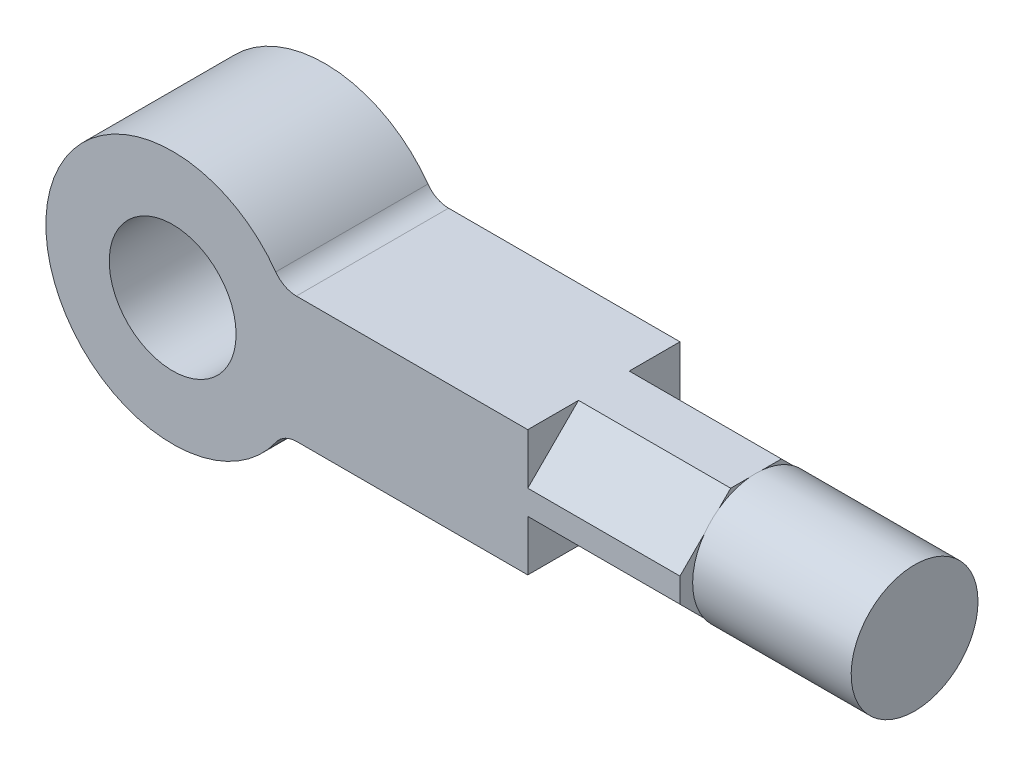
ISO-10303-21;
HEADER;
FILE_DESCRIPTION(('STEP AP214'),'2;1');
FILE_NAME('part.step','',(''),(''),'','','');
FILE_SCHEMA(('AUTOMOTIVE_DESIGN { 1 0 10303 214 1 1 1 1 }'));
ENDSEC;
DATA;
#1=APPLICATION_CONTEXT('core data for automotive mechanical design processes');
#2=APPLICATION_PROTOCOL_DEFINITION('international standard','automotive_design',2000,#1);
#3=PRODUCT_CONTEXT('',#1,'mechanical');
#4=PRODUCT('Part','Part','',(#3));
#5=PRODUCT_RELATED_PRODUCT_CATEGORY('part','',(#4));
#6=PRODUCT_DEFINITION_FORMATION('','',#4);
#7=PRODUCT_DEFINITION_CONTEXT('part definition',#1,'design');
#8=PRODUCT_DEFINITION('design','',#6,#7);
#9=PRODUCT_DEFINITION_SHAPE('','',#8);
#10=(LENGTH_UNIT() NAMED_UNIT(*) SI_UNIT(.MILLI.,.METRE.));
#11=(NAMED_UNIT(*) PLANE_ANGLE_UNIT() SI_UNIT($,.RADIAN.));
#12=(NAMED_UNIT(*) SI_UNIT($,.STERADIAN.) SOLID_ANGLE_UNIT());
#13=UNCERTAINTY_MEASURE_WITH_UNIT(LENGTH_MEASURE(1.E-05),#10,'distance_accuracy_value','');
#14=(GEOMETRIC_REPRESENTATION_CONTEXT(3) GLOBAL_UNCERTAINTY_ASSIGNED_CONTEXT((#13)) GLOBAL_UNIT_ASSIGNED_CONTEXT((#10,
#11,#12)) REPRESENTATION_CONTEXT('',''));
#15=CARTESIAN_POINT('',(0.,0.,0.));
#16=DIRECTION('',(0.,0.,1.));
#17=DIRECTION('',(1.,0.,0.));
#18=AXIS2_PLACEMENT_3D('',#15,#16,#17);
#19=CARTESIAN_POINT('',(80.,9.98244410223354,24.));
#20=DIRECTION('',(-1.,0.,0.));
#21=DIRECTION('',(0.,0.,1.));
#22=AXIS2_PLACEMENT_3D('',#19,#20,#21);
#23=PLANE('',#22);
#24=CARTESIAN_POINT('',(80.,0.0298576009008498,12.));
#25=DIRECTION('',(1.,0.,0.));
#26=DIRECTION('',(0.,0.,-1.));
#27=AXIS2_PLACEMENT_3D('',#24,#25,#26);
#28=CIRCLE('',#27,10.);
#29=CARTESIAN_POINT('',(80.,8.15998467006414,6.17754056783061));
#30=VERTEX_POINT('',#29);
#31=CARTESIAN_POINT('',(80.,9.98244410223354,11.0273634113964));
#32=VERTEX_POINT('',#31);
#33=EDGE_CURVE('E11',#30,#32,#28,.T.);
#34=ORIENTED_EDGE('',*,*,#33,.F.);
#35=DIRECTION('',(0.,-0.707106781186547,-0.707106781186548));
#36=VECTOR('',#35,1.);
#37=CARTESIAN_POINT('',(80.,1.98244410223354,0.));
#38=LINE('',#37,#36);
#39=CARTESIAN_POINT('',(80.,9.98244410223354,8.));
#40=VERTEX_POINT('',#39);
#41=EDGE_CURVE('E183',#40,#30,#38,.T.);
#42=ORIENTED_EDGE('',*,*,#41,.F.);
#43=DIRECTION('',(0.,0.,-1.));
#44=VECTOR('',#43,1.);
#45=CARTESIAN_POINT('',(80.,9.98244410223354,24.));
#46=LINE('',#45,#44);
#47=EDGE_CURVE('E330',#32,#40,#46,.T.);
#48=ORIENTED_EDGE('',*,*,#47,.F.);
#49=EDGE_LOOP('',(#34,#42,#48));
#50=FACE_BOUND('',#49,.T.);
#51=ADVANCED_FACE('F34',(#50),#23,.F.);
#52=CARTESIAN_POINT('',(80.,9.98244410223354,12.9726365886036));
#53=VERTEX_POINT('',#52);
#54=CARTESIAN_POINT('',(80.,8.15998467006414,17.8224594321694));
#55=VERTEX_POINT('',#54);
#56=EDGE_CURVE('E43',#53,#55,#28,.T.);
#57=ORIENTED_EDGE('',*,*,#56,.F.);
#58=CARTESIAN_POINT('',(80.,9.98244410223354,16.));
#59=VERTEX_POINT('',#58);
#60=EDGE_CURVE('E331',#59,#53,#46,.T.);
#61=ORIENTED_EDGE('',*,*,#60,.F.);
#62=DIRECTION('',(0.,0.707106781186548,-0.707106781186548));
#63=VECTOR('',#62,1.);
#64=CARTESIAN_POINT('',(80.,9.98244410223354,16.));
#65=LINE('',#64,#63);
#66=EDGE_CURVE('E233',#55,#59,#65,.T.);
#67=ORIENTED_EDGE('',*,*,#66,.F.);
#68=EDGE_LOOP('',(#57,#61,#67));
#69=FACE_BOUND('',#68,.T.);
#70=ADVANCED_FACE('F393',(#69),#23,.F.);
#71=CARTESIAN_POINT('',(80.,5.85231703307024,20.1301270691633));
#72=VERTEX_POINT('',#71);
#73=CARTESIAN_POINT('',(80.,-5.5948247573359,20.2681889412942));
#74=VERTEX_POINT('',#73);
#75=EDGE_CURVE('E224',#72,#74,#28,.T.);
#76=ORIENTED_EDGE('',*,*,#75,.F.);
#77=CARTESIAN_POINT('',(80.,1.98244410223354,24.));
#78=VERTEX_POINT('',#77);
#79=EDGE_CURVE('E232',#78,#72,#65,.T.);
#80=ORIENTED_EDGE('',*,*,#79,.F.);
#81=DIRECTION('',(0.,1.,0.));
#82=VECTOR('',#81,1.);
#83=CARTESIAN_POINT('',(80.,9.98244410223354,24.));
#84=LINE('',#83,#82);
#85=CARTESIAN_POINT('',(80.,-1.86301369863014,24.));
#86=VERTEX_POINT('',#85);
#87=EDGE_CURVE('E301',#86,#78,#84,.T.);
#88=ORIENTED_EDGE('',*,*,#87,.F.);
#89=DIRECTION('',(0.,0.707106781186548,0.707106781186548));
#90=VECTOR('',#89,1.);
#91=CARTESIAN_POINT('',(80.,-1.86301369863014,24.));
#92=LINE('',#91,#90);
#93=EDGE_CURVE('E52',#74,#86,#92,.T.);
#94=ORIENTED_EDGE('',*,*,#93,.F.);
#95=EDGE_LOOP('',(#76,#80,#88,#94));
#96=FACE_BOUND('',#95,.T.);
#97=ADVANCED_FACE('F405',(#96),#23,.F.);
#98=CARTESIAN_POINT('',(80.,-8.23833134039339,17.6246823582367));
#99=VERTEX_POINT('',#98);
#100=CARTESIAN_POINT('',(80.,-9.86301369863014,13.4598278840042));
#101=VERTEX_POINT('',#100);
#102=EDGE_CURVE('E60',#99,#101,#28,.T.);
#103=ORIENTED_EDGE('',*,*,#102,.F.);
#104=CARTESIAN_POINT('',(80.,-9.86301369863014,16.));
#105=VERTEX_POINT('',#104);
#106=EDGE_CURVE('E249',#105,#99,#92,.T.);
#107=ORIENTED_EDGE('',*,*,#106,.F.);
#108=DIRECTION('',(0.,0.,-1.));
#109=VECTOR('',#108,1.);
#110=CARTESIAN_POINT('',(80.,-9.86301369863014,24.));
#111=LINE('',#110,#109);
#112=EDGE_CURVE('E335',#105,#101,#111,.T.);
#113=ORIENTED_EDGE('',*,*,#112,.T.);
#114=EDGE_LOOP('',(#103,#107,#113));
#115=FACE_BOUND('',#114,.T.);
#116=ADVANCED_FACE('F407',(#115),#23,.F.);
#117=CARTESIAN_POINT('',(80.,-9.86301369863014,10.5401721159958));
#118=VERTEX_POINT('',#117);
#119=CARTESIAN_POINT('',(80.,-8.23833134039339,6.37531764176325));
#120=VERTEX_POINT('',#119);
#121=EDGE_CURVE('E205',#118,#120,#28,.T.);
#122=ORIENTED_EDGE('',*,*,#121,.F.);
#123=CARTESIAN_POINT('',(80.,-9.86301369863014,8.));
#124=VERTEX_POINT('',#123);
#125=EDGE_CURVE('E333',#118,#124,#111,.T.);
#126=ORIENTED_EDGE('',*,*,#125,.T.);
#127=DIRECTION('',(0.,-0.707106781186548,0.707106781186548));
#128=VECTOR('',#127,1.);
#129=CARTESIAN_POINT('',(80.,-1.86301369863014,0.));
#130=LINE('',#129,#128);
#131=EDGE_CURVE('E209',#120,#124,#130,.T.);
#132=ORIENTED_EDGE('',*,*,#131,.F.);
#133=EDGE_LOOP('',(#122,#126,#132));
#134=FACE_BOUND('',#133,.T.);
#135=ADVANCED_FACE('F343',(#134),#23,.F.);
#136=CARTESIAN_POINT('',(19.5912442481735,-13.8630136986301,24.));
#137=DIRECTION('',(0.,0.,1.));
#138=DIRECTION('',(1.,0.,0.));
#139=AXIS2_PLACEMENT_3D('',#136,#137,#138);
#140=PLANE('',#139);
#141=DIRECTION('',(1.,0.,0.));
#142=VECTOR('',#141,1.);
#143=CARTESIAN_POINT('',(56.,-1.86301369863014,24.));
#144=LINE('',#143,#142);
#145=CARTESIAN_POINT('',(56.,-1.86301369863014,24.));
#146=VERTEX_POINT('',#145);
#147=EDGE_CURVE('E236',#146,#86,#144,.T.);
#148=ORIENTED_EDGE('',*,*,#147,.T.);
#149=ORIENTED_EDGE('',*,*,#87,.T.);
#150=DIRECTION('',(1.,0.,0.));
#151=VECTOR('',#150,1.);
#152=CARTESIAN_POINT('',(56.,1.98244410223354,24.));
#153=LINE('',#152,#151);
#154=CARTESIAN_POINT('',(56.,1.98244410223354,24.));
#155=VERTEX_POINT('',#154);
#156=EDGE_CURVE('E243',#155,#78,#153,.T.);
#157=ORIENTED_EDGE('',*,*,#156,.F.);
#158=DIRECTION('',(0.,-1.,0.));
#159=VECTOR('',#158,1.);
#160=CARTESIAN_POINT('',(56.,1.98244410223354,24.));
#161=LINE('',#160,#159);
#162=CARTESIAN_POINT('',(56.,9.98244410223354,24.));
#163=VERTEX_POINT('',#162);
#164=EDGE_CURVE('E235',#163,#155,#161,.T.);
#165=ORIENTED_EDGE('',*,*,#164,.F.);
#166=DIRECTION('',(-1.,0.,0.));
#167=VECTOR('',#166,1.);
#168=CARTESIAN_POINT('',(19.5061850941673,9.98244410223354,24.));
#169=LINE('',#168,#167);
#170=CARTESIAN_POINT('',(19.5061850941673,9.98244410223354,24.));
#171=VERTEX_POINT('',#170);
#172=EDGE_CURVE('E304',#163,#171,#169,.T.);
#173=ORIENTED_EDGE('',*,*,#172,.T.);
#174=CARTESIAN_POINT('',(19.5061850941673,13.9824441022335,24.));
#175=DIRECTION('',(0.,0.,-1.));
#176=DIRECTION('',(-1.,0.,0.));
#177=AXIS2_PLACEMENT_3D('',#174,#175,#176);
#178=CIRCLE('',#177,4.);
#179=CARTESIAN_POINT('',(16.2551542451394,11.6520367518613,24.));
#180=VERTEX_POINT('',#179);
#181=EDGE_CURVE('E306',#171,#180,#178,.T.);
#182=ORIENTED_EDGE('',*,*,#181,.T.);
#183=CARTESIAN_POINT('',(0.,0.,24.));
#184=DIRECTION('',(0.,0.,1.));
#185=DIRECTION('',(1.,0.,0.));
#186=AXIS2_PLACEMENT_3D('',#183,#184,#185);
#187=CIRCLE('',#186,20.);
#188=CARTESIAN_POINT('',(16.326036873478,-11.5525114155251,24.));
#189=VERTEX_POINT('',#188);
#190=EDGE_CURVE('E308',#180,#189,#187,.T.);
#191=ORIENTED_EDGE('',*,*,#190,.T.);
#192=CARTESIAN_POINT('',(19.5912442481735,-13.8630136986301,24.));
#193=DIRECTION('',(0.,0.,-1.));
#194=DIRECTION('',(1.,0.,0.));
#195=AXIS2_PLACEMENT_3D('',#192,#193,#194);
#196=CIRCLE('',#195,4.);
#197=CARTESIAN_POINT('',(19.5912442481735,-9.86301369863014,24.));
#198=VERTEX_POINT('',#197);
#199=EDGE_CURVE('E294',#189,#198,#196,.T.);
#200=ORIENTED_EDGE('',*,*,#199,.T.);
#201=DIRECTION('',(1.,0.,0.));
#202=VECTOR('',#201,1.);
#203=CARTESIAN_POINT('',(19.5912442481735,-9.86301369863014,24.));
#204=LINE('',#203,#202);
#205=CARTESIAN_POINT('',(56.,-9.86301369863014,24.));
#206=VERTEX_POINT('',#205);
#207=EDGE_CURVE('E297',#198,#206,#204,.T.);
#208=ORIENTED_EDGE('',*,*,#207,.T.);
#209=DIRECTION('',(0.,-1.,0.));
#210=VECTOR('',#209,1.);
#211=CARTESIAN_POINT('',(56.,-9.86301369863014,24.));
#212=LINE('',#211,#210);
#213=EDGE_CURVE('E252',#146,#206,#212,.T.);
#214=ORIENTED_EDGE('',*,*,#213,.F.);
#215=EDGE_LOOP('',(#148,#149,#157,#165,#173,#182,#191,#200,#208,#214));
#216=FACE_BOUND('',#215,.T.);
#217=CARTESIAN_POINT('',(0.,0.,24.));
#218=DIRECTION('',(0.,0.,1.));
#219=DIRECTION('',(1.,0.,0.));
#220=AXIS2_PLACEMENT_3D('',#217,#218,#219);
#221=CIRCLE('',#220,10.);
#222=CARTESIAN_POINT('',(10.,0.,24.));
#223=VERTEX_POINT('',#222);
#224=EDGE_CURVE('E288',#223,#223,#221,.T.);
#225=ORIENTED_EDGE('',*,*,#224,.F.);
#226=EDGE_LOOP('',(#225));
#227=FACE_BOUND('',#226,.T.);
#228=ADVANCED_FACE('F402',(#216,#227),#140,.T.);
#229=CARTESIAN_POINT('',(19.5912442481735,-13.8630136986301,0.));
#230=DIRECTION('',(0.,0.,1.));
#231=DIRECTION('',(1.,0.,0.));
#232=AXIS2_PLACEMENT_3D('',#229,#230,#231);
#233=PLANE('',#232);
#234=DIRECTION('',(0.,1.,0.));
#235=VECTOR('',#234,1.);
#236=CARTESIAN_POINT('',(80.,9.98244410223354,0.));
#237=LINE('',#236,#235);
#238=CARTESIAN_POINT('',(80.,-1.86301369863014,0.));
#239=VERTEX_POINT('',#238);
#240=CARTESIAN_POINT('',(80.,1.98244410223354,0.));
#241=VERTEX_POINT('',#240);
#242=EDGE_CURVE('E196',#239,#241,#237,.T.);
#243=ORIENTED_EDGE('',*,*,#242,.F.);
#244=DIRECTION('',(1.,0.,0.));
#245=VECTOR('',#244,1.);
#246=CARTESIAN_POINT('',(56.,-1.86301369863014,0.));
#247=LINE('',#246,#245);
#248=CARTESIAN_POINT('',(56.,-1.86301369863014,0.));
#249=VERTEX_POINT('',#248);
#250=EDGE_CURVE('E268',#249,#239,#247,.T.);
#251=ORIENTED_EDGE('',*,*,#250,.F.);
#252=DIRECTION('',(0.,1.,0.));
#253=VECTOR('',#252,1.);
#254=CARTESIAN_POINT('',(56.,-9.86301369863014,0.));
#255=LINE('',#254,#253);
#256=CARTESIAN_POINT('',(56.,-9.86301369863014,0.));
#257=VERTEX_POINT('',#256);
#258=EDGE_CURVE('E262',#257,#249,#255,.T.);
#259=ORIENTED_EDGE('',*,*,#258,.F.);
#260=DIRECTION('',(1.,0.,0.));
#261=VECTOR('',#260,1.);
#262=CARTESIAN_POINT('',(19.5912442481735,-9.86301369863014,0.));
#263=LINE('',#262,#261);
#264=CARTESIAN_POINT('',(19.5912442481735,-9.86301369863014,0.));
#265=VERTEX_POINT('',#264);
#266=EDGE_CURVE('E313',#265,#257,#263,.T.);
#267=ORIENTED_EDGE('',*,*,#266,.F.);
#268=CARTESIAN_POINT('',(19.5912442481735,-13.8630136986301,0.));
#269=DIRECTION('',(0.,0.,-1.));
#270=DIRECTION('',(1.,0.,0.));
#271=AXIS2_PLACEMENT_3D('',#268,#269,#270);
#272=CIRCLE('',#271,4.);
#273=CARTESIAN_POINT('',(16.326036873478,-11.5525114155251,0.));
#274=VERTEX_POINT('',#273);
#275=EDGE_CURVE('E291',#274,#265,#272,.T.);
#276=ORIENTED_EDGE('',*,*,#275,.F.);
#277=CARTESIAN_POINT('',(0.,0.,0.));
#278=DIRECTION('',(0.,0.,1.));
#279=DIRECTION('',(1.,0.,0.));
#280=AXIS2_PLACEMENT_3D('',#277,#278,#279);
#281=CIRCLE('',#280,20.);
#282=CARTESIAN_POINT('',(16.2551542451394,11.6520367518613,0.));
#283=VERTEX_POINT('',#282);
#284=EDGE_CURVE('E298',#283,#274,#281,.T.);
#285=ORIENTED_EDGE('',*,*,#284,.F.);
#286=CARTESIAN_POINT('',(19.5061850941673,13.9824441022335,0.));
#287=DIRECTION('',(0.,0.,-1.));
#288=DIRECTION('',(-1.,0.,0.));
#289=AXIS2_PLACEMENT_3D('',#286,#287,#288);
#290=CIRCLE('',#289,4.);
#291=CARTESIAN_POINT('',(19.5061850941673,9.98244410223354,0.));
#292=VERTEX_POINT('',#291);
#293=EDGE_CURVE('E319',#292,#283,#290,.T.);
#294=ORIENTED_EDGE('',*,*,#293,.F.);
#295=DIRECTION('',(-1.,0.,0.));
#296=VECTOR('',#295,1.);
#297=CARTESIAN_POINT('',(19.5061850941673,9.98244410223354,0.));
#298=LINE('',#297,#296);
#299=CARTESIAN_POINT('',(56.,9.98244410223354,0.));
#300=VERTEX_POINT('',#299);
#301=EDGE_CURVE('E317',#300,#292,#298,.T.);
#302=ORIENTED_EDGE('',*,*,#301,.F.);
#303=DIRECTION('',(0.,1.,0.));
#304=VECTOR('',#303,1.);
#305=CARTESIAN_POINT('',(56.,9.98244410223354,0.));
#306=LINE('',#305,#304);
#307=CARTESIAN_POINT('',(56.,1.98244410223354,0.));
#308=VERTEX_POINT('',#307);
#309=EDGE_CURVE('E278',#308,#300,#306,.T.);
#310=ORIENTED_EDGE('',*,*,#309,.F.);
#311=DIRECTION('',(1.,0.,0.));
#312=VECTOR('',#311,1.);
#313=CARTESIAN_POINT('',(56.,1.98244410223354,0.));
#314=LINE('',#313,#312);
#315=EDGE_CURVE('E282',#308,#241,#314,.T.);
#316=ORIENTED_EDGE('',*,*,#315,.T.);
#317=EDGE_LOOP('',(#243,#251,#259,#267,#276,#285,#294,#302,#310,#316));
#318=FACE_BOUND('',#317,.T.);
#319=CARTESIAN_POINT('',(0.,0.,0.));
#320=DIRECTION('',(0.,0.,1.));
#321=DIRECTION('',(1.,0.,0.));
#322=AXIS2_PLACEMENT_3D('',#319,#320,#321);
#323=CIRCLE('',#322,10.);
#324=CARTESIAN_POINT('',(10.,0.,0.));
#325=VERTEX_POINT('',#324);
#326=EDGE_CURVE('E286',#325,#325,#323,.T.);
#327=ORIENTED_EDGE('',*,*,#326,.T.);
#328=EDGE_LOOP('',(#327));
#329=FACE_BOUND('',#328,.T.);
#330=ADVANCED_FACE('F356',(#318,#329),#233,.F.);
#331=CARTESIAN_POINT('',(19.5912442481735,-13.8630136986301,24.));
#332=DIRECTION('',(0.,0.,-1.));
#333=DIRECTION('',(-1.,0.,0.));
#334=AXIS2_PLACEMENT_3D('',#331,#332,#333);
#335=CYLINDRICAL_SURFACE('',#334,4.);
#336=ORIENTED_EDGE('',*,*,#275,.T.);
#337=DIRECTION('',(0.,0.,-1.));
#338=VECTOR('',#337,1.);
#339=CARTESIAN_POINT('',(19.5912442481735,-9.86301369863014,24.));
#340=LINE('',#339,#338);
#341=EDGE_CURVE('E38',#198,#265,#340,.T.);
#342=ORIENTED_EDGE('',*,*,#341,.F.);
#343=ORIENTED_EDGE('',*,*,#199,.F.);
#344=DIRECTION('',(0.,0.,-1.));
#345=VECTOR('',#344,1.);
#346=CARTESIAN_POINT('',(16.326036873478,-11.5525114155251,24.));
#347=LINE('',#346,#345);
#348=EDGE_CURVE('E310',#189,#274,#347,.T.);
#349=ORIENTED_EDGE('',*,*,#348,.T.);
#350=EDGE_LOOP('',(#336,#342,#343,#349));
#351=FACE_BOUND('',#350,.T.);
#352=ADVANCED_FACE('F36',(#351),#335,.F.);
#353=CARTESIAN_POINT('',(19.5912442481735,-9.86301369863014,24.));
#354=DIRECTION('',(0.,1.,0.));
#355=DIRECTION('',(0.,0.,1.));
#356=AXIS2_PLACEMENT_3D('',#353,#354,#355);
#357=PLANE('',#356);
#358=DIRECTION('',(0.,0.,-1.));
#359=VECTOR('',#358,1.);
#360=CARTESIAN_POINT('',(56.,-9.86301369863014,8.));
#361=LINE('',#360,#359);
#362=CARTESIAN_POINT('',(56.,-9.86301369863014,8.));
#363=VERTEX_POINT('',#362);
#364=EDGE_CURVE('E260',#363,#257,#361,.T.);
#365=ORIENTED_EDGE('',*,*,#364,.F.);
#366=DIRECTION('',(1.,0.,0.));
#367=VECTOR('',#366,1.);
#368=CARTESIAN_POINT('',(56.,-9.86301369863014,8.));
#369=LINE('',#368,#367);
#370=EDGE_CURVE('E271',#363,#124,#369,.T.);
#371=ORIENTED_EDGE('',*,*,#370,.T.);
#372=ORIENTED_EDGE('',*,*,#125,.F.);
#373=EDGE_CURVE('E336',#101,#118,#111,.T.);
#374=ORIENTED_EDGE('',*,*,#373,.F.);
#375=ORIENTED_EDGE('',*,*,#112,.F.);
#376=DIRECTION('',(1.,0.,0.));
#377=VECTOR('',#376,1.);
#378=CARTESIAN_POINT('',(56.,-9.86301369863014,16.));
#379=LINE('',#378,#377);
#380=CARTESIAN_POINT('',(56.,-9.86301369863014,16.));
#381=VERTEX_POINT('',#380);
#382=EDGE_CURVE('E254',#381,#105,#379,.T.);
#383=ORIENTED_EDGE('',*,*,#382,.F.);
#384=DIRECTION('',(0.,0.,-1.));
#385=VECTOR('',#384,1.);
#386=CARTESIAN_POINT('',(56.,-9.86301369863014,16.));
#387=LINE('',#386,#385);
#388=EDGE_CURVE('E245',#206,#381,#387,.T.);
#389=ORIENTED_EDGE('',*,*,#388,.F.);
#390=ORIENTED_EDGE('',*,*,#207,.F.);
#391=ORIENTED_EDGE('',*,*,#341,.T.);
#392=ORIENTED_EDGE('',*,*,#266,.T.);
#393=EDGE_LOOP('',(#365,#371,#372,#374,#375,#383,#389,#390,#391,#392));
#394=FACE_BOUND('',#393,.T.);
#395=ADVANCED_FACE('F347',(#394),#357,.F.);
#396=CARTESIAN_POINT('',(80.,-5.5948247573359,3.73181105870576));
#397=VERTEX_POINT('',#396);
#398=CARTESIAN_POINT('',(80.,5.85231703307024,3.8698729308367));
#399=VERTEX_POINT('',#398);
#400=EDGE_CURVE('E193',#397,#399,#28,.T.);
#401=ORIENTED_EDGE('',*,*,#400,.F.);
#402=EDGE_CURVE('E263',#239,#397,#130,.T.);
#403=ORIENTED_EDGE('',*,*,#402,.F.);
#404=ORIENTED_EDGE('',*,*,#242,.T.);
#405=EDGE_CURVE('E179',#399,#241,#38,.T.);
#406=ORIENTED_EDGE('',*,*,#405,.F.);
#407=EDGE_LOOP('',(#401,#403,#404,#406));
#408=FACE_BOUND('',#407,.T.);
#409=ADVANCED_FACE('F191',(#408),#23,.F.);
#410=CARTESIAN_POINT('',(19.5061850941673,9.98244410223354,24.));
#411=DIRECTION('',(0.,-1.,0.));
#412=DIRECTION('',(1.,0.,0.));
#413=AXIS2_PLACEMENT_3D('',#410,#411,#412);
#414=PLANE('',#413);
#415=DIRECTION('',(0.,0.,1.));
#416=VECTOR('',#415,1.);
#417=CARTESIAN_POINT('',(56.,9.98244410223354,24.));
#418=LINE('',#417,#416);
#419=CARTESIAN_POINT('',(56.,9.98244410223354,16.));
#420=VERTEX_POINT('',#419);
#421=EDGE_CURVE('E239',#420,#163,#418,.T.);
#422=ORIENTED_EDGE('',*,*,#421,.F.);
#423=DIRECTION('',(1.,0.,0.));
#424=VECTOR('',#423,1.);
#425=CARTESIAN_POINT('',(56.,9.98244410223354,16.));
#426=LINE('',#425,#424);
#427=EDGE_CURVE('E197',#420,#59,#426,.T.);
#428=ORIENTED_EDGE('',*,*,#427,.T.);
#429=ORIENTED_EDGE('',*,*,#60,.T.);
#430=EDGE_CURVE('E334',#53,#32,#46,.T.);
#431=ORIENTED_EDGE('',*,*,#430,.T.);
#432=ORIENTED_EDGE('',*,*,#47,.T.);
#433=DIRECTION('',(1.,0.,0.));
#434=VECTOR('',#433,1.);
#435=CARTESIAN_POINT('',(56.,9.98244410223354,8.));
#436=LINE('',#435,#434);
#437=CARTESIAN_POINT('',(56.,9.98244410223354,8.));
#438=VERTEX_POINT('',#437);
#439=EDGE_CURVE('E284',#438,#40,#436,.T.);
#440=ORIENTED_EDGE('',*,*,#439,.F.);
#441=DIRECTION('',(0.,0.,1.));
#442=VECTOR('',#441,1.);
#443=CARTESIAN_POINT('',(56.,9.98244410223354,8.));
#444=LINE('',#443,#442);
#445=EDGE_CURVE('E280',#300,#438,#444,.T.);
#446=ORIENTED_EDGE('',*,*,#445,.F.);
#447=ORIENTED_EDGE('',*,*,#301,.T.);
#448=DIRECTION('',(0.,0.,-1.));
#449=VECTOR('',#448,1.);
#450=CARTESIAN_POINT('',(19.5061850941673,9.98244410223354,24.));
#451=LINE('',#450,#449);
#452=EDGE_CURVE('E327',#171,#292,#451,.T.);
#453=ORIENTED_EDGE('',*,*,#452,.F.);
#454=ORIENTED_EDGE('',*,*,#172,.F.);
#455=EDGE_LOOP('',(#422,#428,#429,#431,#432,#440,#446,#447,#453,#454));
#456=FACE_BOUND('',#455,.T.);
#457=ADVANCED_FACE('F378',(#456),#414,.F.);
#458=CARTESIAN_POINT('',(19.5061850941673,13.9824441022335,24.));
#459=DIRECTION('',(0.,0.,-1.));
#460=DIRECTION('',(-1.,0.,0.));
#461=AXIS2_PLACEMENT_3D('',#458,#459,#460);
#462=CYLINDRICAL_SURFACE('',#461,4.);
#463=ORIENTED_EDGE('',*,*,#293,.T.);
#464=DIRECTION('',(0.,0.,-1.));
#465=VECTOR('',#464,1.);
#466=CARTESIAN_POINT('',(16.2551542451394,11.6520367518613,24.));
#467=LINE('',#466,#465);
#468=EDGE_CURVE('E324',#180,#283,#467,.T.);
#469=ORIENTED_EDGE('',*,*,#468,.F.);
#470=ORIENTED_EDGE('',*,*,#181,.F.);
#471=ORIENTED_EDGE('',*,*,#452,.T.);
#472=EDGE_LOOP('',(#463,#469,#470,#471));
#473=FACE_BOUND('',#472,.T.);
#474=ADVANCED_FACE('F373',(#473),#462,.F.);
#475=CARTESIAN_POINT('',(0.,0.,24.));
#476=DIRECTION('',(0.,0.,-1.));
#477=DIRECTION('',(-1.,0.,0.));
#478=AXIS2_PLACEMENT_3D('',#475,#476,#477);
#479=CYLINDRICAL_SURFACE('',#478,20.);
#480=ORIENTED_EDGE('',*,*,#284,.T.);
#481=ORIENTED_EDGE('',*,*,#348,.F.);
#482=ORIENTED_EDGE('',*,*,#190,.F.);
#483=ORIENTED_EDGE('',*,*,#468,.T.);
#484=EDGE_LOOP('',(#480,#481,#482,#483));
#485=FACE_BOUND('',#484,.T.);
#486=ADVANCED_FACE('F368',(#485),#479,.T.);
#487=CARTESIAN_POINT('',(0.,0.,24.));
#488=DIRECTION('',(0.,0.,-1.));
#489=DIRECTION('',(-1.,0.,0.));
#490=AXIS2_PLACEMENT_3D('',#487,#488,#489);
#491=CYLINDRICAL_SURFACE('',#490,10.);
#492=ORIENTED_EDGE('',*,*,#224,.T.);
#493=EDGE_LOOP('',(#492));
#494=FACE_BOUND('',#493,.T.);
#495=ORIENTED_EDGE('',*,*,#326,.F.);
#496=EDGE_LOOP('',(#495));
#497=FACE_BOUND('',#496,.T.);
#498=ADVANCED_FACE('F432',(#494,#497),#491,.F.);
#499=CARTESIAN_POINT('',(56.,1.98244410223354,0.));
#500=DIRECTION('',(0.,-0.707106781186548,0.707106781186548));
#501=DIRECTION('',(0.,-0.707106781186548,-0.707106781186548));
#502=AXIS2_PLACEMENT_3D('',#499,#500,#501);
#503=PLANE('',#502);
#504=ORIENTED_EDGE('',*,*,#41,.T.);
#505=EDGE_CURVE('E176',#30,#399,#38,.T.);
#506=ORIENTED_EDGE('',*,*,#505,.T.);
#507=ORIENTED_EDGE('',*,*,#405,.T.);
#508=ORIENTED_EDGE('',*,*,#315,.F.);
#509=DIRECTION('',(0.,-0.707106781186547,-0.707106781186548));
#510=VECTOR('',#509,1.);
#511=CARTESIAN_POINT('',(56.,1.98244410223354,0.));
#512=LINE('',#511,#510);
#513=EDGE_CURVE('E275',#438,#308,#512,.T.);
#514=ORIENTED_EDGE('',*,*,#513,.F.);
#515=ORIENTED_EDGE('',*,*,#439,.T.);
#516=EDGE_LOOP('',(#504,#506,#507,#508,#514,#515));
#517=FACE_BOUND('',#516,.T.);
#518=ADVANCED_FACE('F178',(#517),#503,.F.);
#519=CARTESIAN_POINT('',(56.,0.,0.));
#520=DIRECTION('',(-1.,0.,0.));
#521=DIRECTION('',(0.,0.,1.));
#522=AXIS2_PLACEMENT_3D('',#519,#520,#521);
#523=PLANE('',#522);
#524=ORIENTED_EDGE('',*,*,#513,.T.);
#525=ORIENTED_EDGE('',*,*,#309,.T.);
#526=ORIENTED_EDGE('',*,*,#445,.T.);
#527=EDGE_LOOP('',(#524,#525,#526));
#528=FACE_BOUND('',#527,.T.);
#529=ADVANCED_FACE('F383',(#528),#523,.F.);
#530=CARTESIAN_POINT('',(56.,9.98244410223354,16.));
#531=DIRECTION('',(0.,-0.707106781186548,-0.707106781186548));
#532=DIRECTION('',(0.,0.707106781186548,-0.707106781186548));
#533=AXIS2_PLACEMENT_3D('',#530,#531,#532);
#534=PLANE('',#533);
#535=ORIENTED_EDGE('',*,*,#79,.T.);
#536=EDGE_CURVE('E229',#72,#55,#65,.T.);
#537=ORIENTED_EDGE('',*,*,#536,.T.);
#538=ORIENTED_EDGE('',*,*,#66,.T.);
#539=ORIENTED_EDGE('',*,*,#427,.F.);
#540=DIRECTION('',(0.,0.707106781186548,-0.707106781186548));
#541=VECTOR('',#540,1.);
#542=CARTESIAN_POINT('',(56.,9.98244410223354,16.));
#543=LINE('',#542,#541);
#544=EDGE_CURVE('E395',#155,#420,#543,.T.);
#545=ORIENTED_EDGE('',*,*,#544,.F.);
#546=ORIENTED_EDGE('',*,*,#156,.T.);
#547=EDGE_LOOP('',(#535,#537,#538,#539,#545,#546));
#548=FACE_BOUND('',#547,.T.);
#549=ADVANCED_FACE('F394',(#548),#534,.F.);
#550=CARTESIAN_POINT('',(56.,0.,0.));
#551=DIRECTION('',(-1.,0.,0.));
#552=DIRECTION('',(0.,0.,1.));
#553=AXIS2_PLACEMENT_3D('',#550,#551,#552);
#554=PLANE('',#553);
#555=ORIENTED_EDGE('',*,*,#164,.T.);
#556=ORIENTED_EDGE('',*,*,#544,.T.);
#557=ORIENTED_EDGE('',*,*,#421,.T.);
#558=EDGE_LOOP('',(#555,#556,#557));
#559=FACE_BOUND('',#558,.T.);
#560=ADVANCED_FACE('F400',(#559),#554,.F.);
#561=CARTESIAN_POINT('',(56.,-1.86301369863014,24.));
#562=DIRECTION('',(0.,0.707106781186548,-0.707106781186548));
#563=DIRECTION('',(0.,0.707106781186548,0.707106781186548));
#564=AXIS2_PLACEMENT_3D('',#561,#562,#563);
#565=PLANE('',#564);
#566=ORIENTED_EDGE('',*,*,#106,.T.);
#567=EDGE_CURVE('E256',#99,#74,#92,.T.);
#568=ORIENTED_EDGE('',*,*,#567,.T.);
#569=ORIENTED_EDGE('',*,*,#93,.T.);
#570=ORIENTED_EDGE('',*,*,#147,.F.);
#571=DIRECTION('',(0.,0.707106781186548,0.707106781186548));
#572=VECTOR('',#571,1.);
#573=CARTESIAN_POINT('',(56.,-1.86301369863014,24.));
#574=LINE('',#573,#572);
#575=EDGE_CURVE('E248',#381,#146,#574,.T.);
#576=ORIENTED_EDGE('',*,*,#575,.F.);
#577=ORIENTED_EDGE('',*,*,#382,.T.);
#578=EDGE_LOOP('',(#566,#568,#569,#570,#576,#577));
#579=FACE_BOUND('',#578,.T.);
#580=ADVANCED_FACE('F478',(#579),#565,.F.);
#581=CARTESIAN_POINT('',(56.,0.,0.));
#582=DIRECTION('',(-1.,0.,0.));
#583=DIRECTION('',(0.,0.,1.));
#584=AXIS2_PLACEMENT_3D('',#581,#582,#583);
#585=PLANE('',#584);
#586=ORIENTED_EDGE('',*,*,#388,.T.);
#587=ORIENTED_EDGE('',*,*,#575,.T.);
#588=ORIENTED_EDGE('',*,*,#213,.T.);
#589=EDGE_LOOP('',(#586,#587,#588));
#590=FACE_BOUND('',#589,.T.);
#591=ADVANCED_FACE('F485',(#590),#585,.F.);
#592=CARTESIAN_POINT('',(56.,-1.86301369863014,0.));
#593=DIRECTION('',(0.,0.707106781186548,0.707106781186548));
#594=DIRECTION('',(0.,-0.707106781186548,0.707106781186548));
#595=AXIS2_PLACEMENT_3D('',#592,#593,#594);
#596=PLANE('',#595);
#597=ORIENTED_EDGE('',*,*,#402,.T.);
#598=EDGE_CURVE('E270',#397,#120,#130,.T.);
#599=ORIENTED_EDGE('',*,*,#598,.T.);
#600=ORIENTED_EDGE('',*,*,#131,.T.);
#601=ORIENTED_EDGE('',*,*,#370,.F.);
#602=DIRECTION('',(0.,-0.707106781186548,0.707106781186548));
#603=VECTOR('',#602,1.);
#604=CARTESIAN_POINT('',(56.,-1.86301369863014,0.));
#605=LINE('',#604,#603);
#606=EDGE_CURVE('E265',#249,#363,#605,.T.);
#607=ORIENTED_EDGE('',*,*,#606,.F.);
#608=ORIENTED_EDGE('',*,*,#250,.T.);
#609=EDGE_LOOP('',(#597,#599,#600,#601,#607,#608));
#610=FACE_BOUND('',#609,.T.);
#611=ADVANCED_FACE('F350',(#610),#596,.F.);
#612=CARTESIAN_POINT('',(56.,0.,0.));
#613=DIRECTION('',(1.,0.,0.));
#614=DIRECTION('',(0.,0.,-1.));
#615=AXIS2_PLACEMENT_3D('',#612,#613,#614);
#616=PLANE('',#615);
#617=ORIENTED_EDGE('',*,*,#364,.T.);
#618=ORIENTED_EDGE('',*,*,#258,.T.);
#619=ORIENTED_EDGE('',*,*,#606,.T.);
#620=EDGE_LOOP('',(#617,#618,#619));
#621=FACE_BOUND('',#620,.T.);
#622=ADVANCED_FACE('F353',(#621),#616,.T.);
#623=CARTESIAN_POINT('',(80.,0.0298576009008498,12.));
#624=DIRECTION('',(1.,0.,0.));
#625=DIRECTION('',(0.,0.,-1.));
#626=AXIS2_PLACEMENT_3D('',#623,#624,#625);
#627=PLANE('',#626);
#628=EDGE_CURVE('E214',#101,#118,#28,.T.);
#629=ORIENTED_EDGE('',*,*,#628,.F.);
#630=ORIENTED_EDGE('',*,*,#373,.T.);
#631=EDGE_LOOP('',(#629,#630));
#632=FACE_BOUND('',#631,.T.);
#633=ADVANCED_FACE('F506',(#632),#627,.F.);
#634=ORIENTED_EDGE('',*,*,#598,.F.);
#635=EDGE_CURVE('E204',#120,#397,#28,.T.);
#636=ORIENTED_EDGE('',*,*,#635,.F.);
#637=EDGE_LOOP('',(#634,#636));
#638=FACE_BOUND('',#637,.T.);
#639=ADVANCED_FACE('F512',(#638),#627,.F.);
#640=ORIENTED_EDGE('',*,*,#505,.F.);
#641=EDGE_CURVE('E201',#399,#30,#28,.T.);
#642=ORIENTED_EDGE('',*,*,#641,.F.);
#643=EDGE_LOOP('',(#640,#642));
#644=FACE_BOUND('',#643,.T.);
#645=ADVANCED_FACE('F206',(#644),#627,.F.);
#646=ORIENTED_EDGE('',*,*,#430,.F.);
#647=EDGE_CURVE('E45',#32,#53,#28,.T.);
#648=ORIENTED_EDGE('',*,*,#647,.F.);
#649=EDGE_LOOP('',(#646,#648));
#650=FACE_BOUND('',#649,.T.);
#651=ADVANCED_FACE('F389',(#650),#627,.F.);
#652=ORIENTED_EDGE('',*,*,#536,.F.);
#653=EDGE_CURVE('E212',#55,#72,#28,.T.);
#654=ORIENTED_EDGE('',*,*,#653,.F.);
#655=EDGE_LOOP('',(#652,#654));
#656=FACE_BOUND('',#655,.T.);
#657=ADVANCED_FACE('F227',(#656),#627,.F.);
#658=CARTESIAN_POINT('',(105.,0.0298576009008498,12.));
#659=DIRECTION('',(-1.,0.,0.));
#660=DIRECTION('',(0.,0.,1.));
#661=AXIS2_PLACEMENT_3D('',#658,#659,#660);
#662=CYLINDRICAL_SURFACE('',#661,10.);
#663=CARTESIAN_POINT('',(105.,0.0298576009008498,12.));
#664=DIRECTION('',(1.,0.,0.));
#665=DIRECTION('',(0.,0.,-1.));
#666=AXIS2_PLACEMENT_3D('',#663,#664,#665);
#667=CIRCLE('',#666,10.);
#668=CARTESIAN_POINT('',(105.,0.0298576009008498,2.));
#669=VERTEX_POINT('',#668);
#670=EDGE_CURVE('E207',#669,#669,#667,.T.);
#671=ORIENTED_EDGE('',*,*,#670,.F.);
#672=EDGE_LOOP('',(#671));
#673=FACE_BOUND('',#672,.T.);
#674=ORIENTED_EDGE('',*,*,#641,.T.);
#675=ORIENTED_EDGE('',*,*,#33,.T.);
#676=ORIENTED_EDGE('',*,*,#647,.T.);
#677=ORIENTED_EDGE('',*,*,#56,.T.);
#678=ORIENTED_EDGE('',*,*,#653,.T.);
#679=ORIENTED_EDGE('',*,*,#75,.T.);
#680=EDGE_CURVE('E216',#74,#99,#28,.T.);
#681=ORIENTED_EDGE('',*,*,#680,.T.);
#682=ORIENTED_EDGE('',*,*,#102,.T.);
#683=ORIENTED_EDGE('',*,*,#628,.T.);
#684=ORIENTED_EDGE('',*,*,#121,.T.);
#685=ORIENTED_EDGE('',*,*,#635,.T.);
#686=ORIENTED_EDGE('',*,*,#400,.T.);
#687=EDGE_LOOP('',(#674,#675,#676,#677,#678,#679,#681,#682,#683,#684,#685,#686));
#688=FACE_BOUND('',#687,.T.);
#689=ADVANCED_FACE('F200',(#673,#688),#662,.T.);
#690=CARTESIAN_POINT('',(105.,0.0298576009008498,12.));
#691=DIRECTION('',(1.,0.,0.));
#692=DIRECTION('',(0.,0.,-1.));
#693=AXIS2_PLACEMENT_3D('',#690,#691,#692);
#694=PLANE('',#693);
#695=ORIENTED_EDGE('',*,*,#670,.T.);
#696=EDGE_LOOP('',(#695));
#697=FACE_BOUND('',#696,.T.);
#698=ADVANCED_FACE('F542',(#697),#694,.T.);
#699=ORIENTED_EDGE('',*,*,#567,.F.);
#700=ORIENTED_EDGE('',*,*,#680,.F.);
#701=EDGE_LOOP('',(#699,#700));
#702=FACE_BOUND('',#701,.T.);
#703=ADVANCED_FACE('F515',(#702),#627,.F.);
#704=CLOSED_SHELL('',(#51,#70,#97,#116,#135,#228,#330,#352,#395,#409,#457,#474,#486,#498,#518,
#529,#549,#560,#580,#591,#611,#622,#633,#639,#645,#651,#657,#689,#698,#703));
#705=MANIFOLD_SOLID_BREP('B2',#704);
#706=ADVANCED_BREP_SHAPE_REPRESENTATION('',(#18,#705),#14);
#707=SHAPE_DEFINITION_REPRESENTATION(#9,#706);
ENDSEC;
END-ISO-10303-21;
